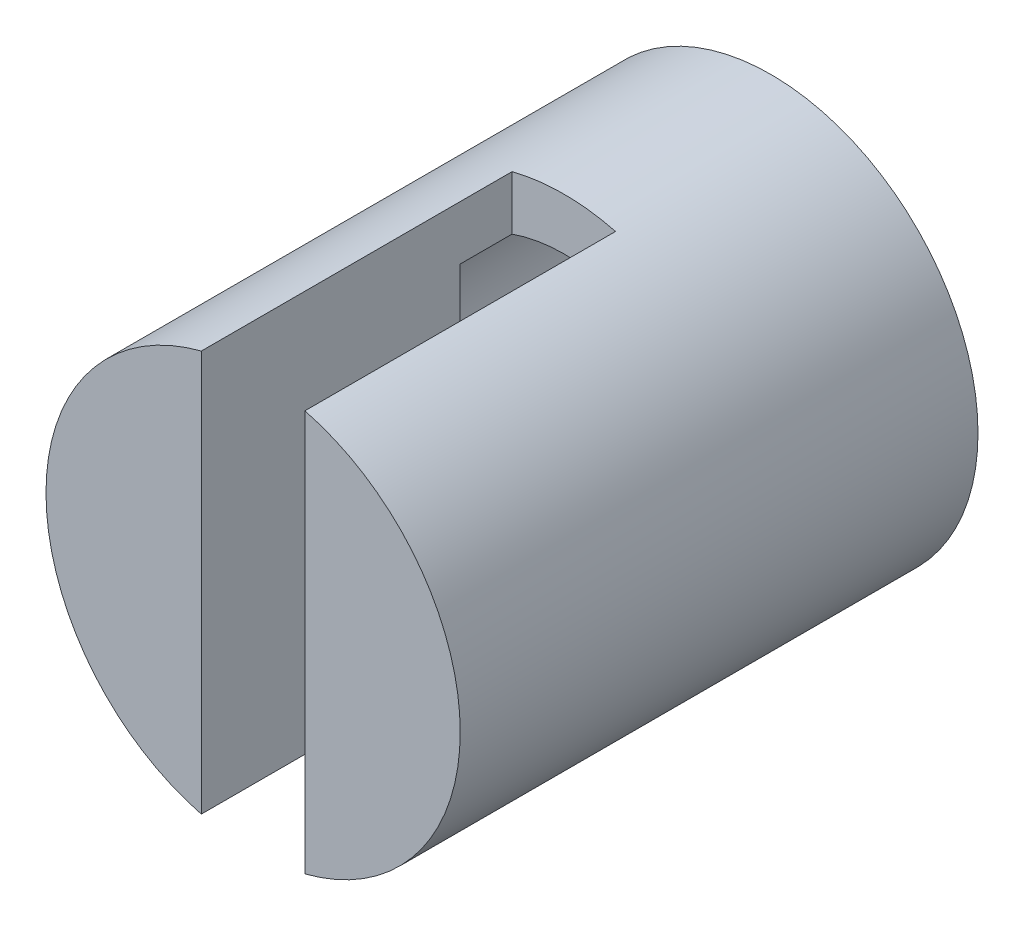
ISO-10303-21;
HEADER;
FILE_DESCRIPTION(('STEP AP214'),'2;1');
FILE_NAME('part.step','',(''),(''),'','','');
FILE_SCHEMA(('AUTOMOTIVE_DESIGN { 1 0 10303 214 1 1 1 1 }'));
ENDSEC;
DATA;
#1=APPLICATION_CONTEXT('core data for automotive mechanical design processes');
#2=APPLICATION_PROTOCOL_DEFINITION('international standard','automotive_design',2000,#1);
#3=PRODUCT_CONTEXT('',#1,'mechanical');
#4=PRODUCT('Part','Part','',(#3));
#5=PRODUCT_RELATED_PRODUCT_CATEGORY('part','',(#4));
#6=PRODUCT_DEFINITION_FORMATION('','',#4);
#7=PRODUCT_DEFINITION_CONTEXT('part definition',#1,'design');
#8=PRODUCT_DEFINITION('design','',#6,#7);
#9=PRODUCT_DEFINITION_SHAPE('','',#8);
#10=(LENGTH_UNIT() NAMED_UNIT(*) SI_UNIT(.MILLI.,.METRE.));
#11=(NAMED_UNIT(*) PLANE_ANGLE_UNIT() SI_UNIT($,.RADIAN.));
#12=(NAMED_UNIT(*) SI_UNIT($,.STERADIAN.) SOLID_ANGLE_UNIT());
#13=UNCERTAINTY_MEASURE_WITH_UNIT(LENGTH_MEASURE(1.E-05),#10,'distance_accuracy_value','');
#14=(GEOMETRIC_REPRESENTATION_CONTEXT(3) GLOBAL_UNCERTAINTY_ASSIGNED_CONTEXT((#13)) GLOBAL_UNIT_ASSIGNED_CONTEXT((#10,
#11,#12)) REPRESENTATION_CONTEXT('',''));
#15=CARTESIAN_POINT('',(0.,0.,0.));
#16=DIRECTION('',(0.,0.,1.));
#17=DIRECTION('',(1.,0.,0.));
#18=AXIS2_PLACEMENT_3D('',#15,#16,#17);
#19=CARTESIAN_POINT('',(0.,0.,-6.));
#20=DIRECTION('',(0.,0.,-1.));
#21=DIRECTION('',(-1.,0.,0.));
#22=AXIS2_PLACEMENT_3D('',#19,#20,#21);
#23=PLANE('',#22);
#24=DIRECTION('',(0.,-1.,0.));
#25=VECTOR('',#24,1.);
#26=CARTESIAN_POINT('',(-1.,38.1192192103208,-6.));
#27=LINE('',#26,#25);
#28=CARTESIAN_POINT('',(-1.,48.522106153225,-6.));
#29=VERTEX_POINT('',#28);
#30=CARTESIAN_POINT('',(-1.,47.4775499317637,-6.));
#31=VERTEX_POINT('',#30);
#32=EDGE_CURVE('E144',#29,#31,#27,.T.);
#33=ORIENTED_EDGE('',*,*,#32,.T.);
#34=CARTESIAN_POINT('',(0.,44.6491228070175,-6.));
#35=DIRECTION('',(0.,0.,-1.));
#36=DIRECTION('',(-1.,0.,0.));
#37=AXIS2_PLACEMENT_3D('',#34,#35,#36);
#38=CIRCLE('',#37,3.);
#39=CARTESIAN_POINT('',(1.,47.4775499317637,-6.));
#40=VERTEX_POINT('',#39);
#41=EDGE_CURVE('E54',#31,#40,#38,.T.);
#42=ORIENTED_EDGE('',*,*,#41,.T.);
#43=DIRECTION('',(0.,1.,0.));
#44=VECTOR('',#43,1.);
#45=CARTESIAN_POINT('',(1.,38.1192192103208,-6.));
#46=LINE('',#45,#44);
#47=CARTESIAN_POINT('',(1.,48.522106153225,-6.));
#48=VERTEX_POINT('',#47);
#49=EDGE_CURVE('E139',#40,#48,#46,.T.);
#50=ORIENTED_EDGE('',*,*,#49,.T.);
#51=CARTESIAN_POINT('',(0.,44.6491228070175,-6.));
#52=DIRECTION('',(0.,0.,-1.));
#53=DIRECTION('',(-1.,0.,0.));
#54=AXIS2_PLACEMENT_3D('',#51,#52,#53);
#55=CIRCLE('',#54,4.);
#56=EDGE_CURVE('E189',#48,#29,#55,.F.);
#57=ORIENTED_EDGE('',*,*,#56,.T.);
#58=EDGE_LOOP('',(#33,#42,#50,#57));
#59=FACE_BOUND('',#58,.T.);
#60=ADVANCED_FACE('F46',(#59),#23,.F.);
#61=CARTESIAN_POINT('',(0.,44.6491228070175,0.));
#62=DIRECTION('',(0.,0.,1.));
#63=DIRECTION('',(1.,0.,0.));
#64=AXIS2_PLACEMENT_3D('',#61,#62,#63);
#65=PLANE('',#64);
#66=DIRECTION('',(0.,1.,0.));
#67=VECTOR('',#66,1.);
#68=CARTESIAN_POINT('',(1.,44.6491228070175,0.));
#69=LINE('',#68,#67);
#70=CARTESIAN_POINT('',(1.,40.7761394608101,0.));
#71=VERTEX_POINT('',#70);
#72=CARTESIAN_POINT('',(1.,48.522106153225,0.));
#73=VERTEX_POINT('',#72);
#74=EDGE_CURVE('E186',#71,#73,#69,.T.);
#75=ORIENTED_EDGE('',*,*,#74,.F.);
#76=CARTESIAN_POINT('',(0.,44.6491228070175,0.));
#77=DIRECTION('',(0.,0.,1.));
#78=DIRECTION('',(1.,0.,0.));
#79=AXIS2_PLACEMENT_3D('',#76,#77,#78);
#80=CIRCLE('',#79,4.);
#81=EDGE_CURVE('E177',#71,#73,#80,.T.);
#82=ORIENTED_EDGE('',*,*,#81,.T.);
#83=EDGE_LOOP('',(#75,#82));
#84=FACE_BOUND('',#83,.T.);
#85=ADVANCED_FACE('F225',(#84),#65,.T.);
#86=CARTESIAN_POINT('',(0.,44.6491228070175,-10.));
#87=DIRECTION('',(0.,0.,1.));
#88=DIRECTION('',(1.,0.,0.));
#89=AXIS2_PLACEMENT_3D('',#86,#87,#88);
#90=CYLINDRICAL_SURFACE('',#89,4.);
#91=DIRECTION('',(0.,0.,1.));
#92=VECTOR('',#91,1.);
#93=CARTESIAN_POINT('',(1.,40.7761394608101,-10.));
#94=LINE('',#93,#92);
#95=CARTESIAN_POINT('',(1.,40.7761394608101,-6.));
#96=VERTEX_POINT('',#95);
#97=EDGE_CURVE('E160',#96,#71,#94,.T.);
#98=ORIENTED_EDGE('',*,*,#97,.F.);
#99=CARTESIAN_POINT('',(-1.,40.7761394608101,-6.));
#100=VERTEX_POINT('',#99);
#101=EDGE_CURVE('E192',#100,#96,#55,.F.);
#102=ORIENTED_EDGE('',*,*,#101,.F.);
#103=DIRECTION('',(0.,0.,1.));
#104=VECTOR('',#103,1.);
#105=CARTESIAN_POINT('',(-1.,40.7761394608101,-10.));
#106=LINE('',#105,#104);
#107=CARTESIAN_POINT('',(-1.,40.7761394608101,0.));
#108=VERTEX_POINT('',#107);
#109=EDGE_CURVE('E165',#108,#100,#106,.F.);
#110=ORIENTED_EDGE('',*,*,#109,.F.);
#111=CARTESIAN_POINT('',(-1.,48.522106153225,0.));
#112=VERTEX_POINT('',#111);
#113=EDGE_CURVE('E176',#112,#108,#80,.T.);
#114=ORIENTED_EDGE('',*,*,#113,.F.);
#115=DIRECTION('',(0.,0.,1.));
#116=VECTOR('',#115,1.);
#117=CARTESIAN_POINT('',(-1.,48.522106153225,-10.));
#118=LINE('',#117,#116);
#119=EDGE_CURVE('E69',#29,#112,#118,.T.);
#120=ORIENTED_EDGE('',*,*,#119,.F.);
#121=ORIENTED_EDGE('',*,*,#56,.F.);
#122=DIRECTION('',(0.,0.,1.));
#123=VECTOR('',#122,1.);
#124=CARTESIAN_POINT('',(1.,48.522106153225,-10.));
#125=LINE('',#124,#123);
#126=EDGE_CURVE('E164',#73,#48,#125,.F.);
#127=ORIENTED_EDGE('',*,*,#126,.F.);
#128=ORIENTED_EDGE('',*,*,#81,.F.);
#129=EDGE_LOOP('',(#98,#102,#110,#114,#120,#121,#127,#128));
#130=FACE_BOUND('',#129,.T.);
#131=CARTESIAN_POINT('',(0.,44.6491228070175,-10.));
#132=DIRECTION('',(0.,0.,1.));
#133=DIRECTION('',(1.,0.,0.));
#134=AXIS2_PLACEMENT_3D('',#131,#132,#133);
#135=CIRCLE('',#134,4.);
#136=CARTESIAN_POINT('',(4.,44.6491228070175,-10.));
#137=VERTEX_POINT('',#136);
#138=EDGE_CURVE('E172',#137,#137,#135,.T.);
#139=ORIENTED_EDGE('',*,*,#138,.T.);
#140=EDGE_LOOP('',(#139));
#141=FACE_BOUND('',#140,.T.);
#142=ADVANCED_FACE('F48',(#130,#141),#90,.T.);
#143=CARTESIAN_POINT('',(0.,44.6491228070175,-10.));
#144=DIRECTION('',(0.,0.,1.));
#145=DIRECTION('',(1.,0.,0.));
#146=AXIS2_PLACEMENT_3D('',#143,#144,#145);
#147=PLANE('',#146);
#148=CARTESIAN_POINT('',(0.,44.6491228070175,-10.));
#149=DIRECTION('',(0.,0.,-1.));
#150=DIRECTION('',(-1.,0.,0.));
#151=AXIS2_PLACEMENT_3D('',#148,#149,#150);
#152=CIRCLE('',#151,3.);
#153=CARTESIAN_POINT('',(-3.,44.6491228070175,-10.));
#154=VERTEX_POINT('',#153);
#155=EDGE_CURVE('E123',#154,#154,#152,.T.);
#156=ORIENTED_EDGE('',*,*,#155,.F.);
#157=EDGE_LOOP('',(#156));
#158=FACE_BOUND('',#157,.T.);
#159=ORIENTED_EDGE('',*,*,#138,.F.);
#160=EDGE_LOOP('',(#159));
#161=FACE_BOUND('',#160,.T.);
#162=ADVANCED_FACE('F224',(#158,#161),#147,.F.);
#163=DIRECTION('',(0.,-1.,0.));
#164=VECTOR('',#163,1.);
#165=CARTESIAN_POINT('',(-1.,44.6491228070175,0.));
#166=LINE('',#165,#164);
#167=EDGE_CURVE('E175',#112,#108,#166,.T.);
#168=ORIENTED_EDGE('',*,*,#167,.F.);
#169=ORIENTED_EDGE('',*,*,#113,.T.);
#170=EDGE_LOOP('',(#168,#169));
#171=FACE_BOUND('',#170,.T.);
#172=ADVANCED_FACE('F222',(#171),#65,.T.);
#173=CARTESIAN_POINT('',(1.,38.1192192103208,-6.));
#174=DIRECTION('',(1.,0.,0.));
#175=DIRECTION('',(0.,0.,-1.));
#176=AXIS2_PLACEMENT_3D('',#173,#174,#175);
#177=PLANE('',#176);
#178=DIRECTION('',(0.,1.,0.));
#179=VECTOR('',#178,1.);
#180=CARTESIAN_POINT('',(1.,38.1192192103208,-5.));
#181=LINE('',#180,#179);
#182=CARTESIAN_POINT('',(1.,41.8206956822714,-5.));
#183=VERTEX_POINT('',#182);
#184=CARTESIAN_POINT('',(1.,47.4775499317637,-5.));
#185=VERTEX_POINT('',#184);
#186=EDGE_CURVE('E137',#183,#185,#181,.T.);
#187=ORIENTED_EDGE('',*,*,#186,.F.);
#188=DIRECTION('',(0.,0.,-1.));
#189=VECTOR('',#188,1.);
#190=CARTESIAN_POINT('',(1.,41.8206956822714,-5.));
#191=LINE('',#190,#189);
#192=CARTESIAN_POINT('',(1.,41.8206956822714,-6.));
#193=VERTEX_POINT('',#192);
#194=EDGE_CURVE('E118',#183,#193,#191,.T.);
#195=ORIENTED_EDGE('',*,*,#194,.T.);
#196=EDGE_CURVE('E140',#96,#193,#46,.T.);
#197=ORIENTED_EDGE('',*,*,#196,.F.);
#198=ORIENTED_EDGE('',*,*,#97,.T.);
#199=ORIENTED_EDGE('',*,*,#74,.T.);
#200=ORIENTED_EDGE('',*,*,#126,.T.);
#201=ORIENTED_EDGE('',*,*,#49,.F.);
#202=DIRECTION('',(0.,0.,-1.));
#203=VECTOR('',#202,1.);
#204=CARTESIAN_POINT('',(1.,47.4775499317637,-5.));
#205=LINE('',#204,#203);
#206=EDGE_CURVE('E117',#40,#185,#205,.F.);
#207=ORIENTED_EDGE('',*,*,#206,.T.);
#208=EDGE_LOOP('',(#187,#195,#197,#198,#199,#200,#201,#207));
#209=FACE_BOUND('',#208,.T.);
#210=ADVANCED_FACE('F203',(#209),#177,.F.);
#211=CARTESIAN_POINT('',(-1.,38.1192192103208,-6.));
#212=DIRECTION('',(-1.,0.,0.));
#213=DIRECTION('',(0.,0.,1.));
#214=AXIS2_PLACEMENT_3D('',#211,#212,#213);
#215=PLANE('',#214);
#216=DIRECTION('',(0.,-1.,0.));
#217=VECTOR('',#216,1.);
#218=CARTESIAN_POINT('',(-1.,38.1192192103208,-5.));
#219=LINE('',#218,#217);
#220=CARTESIAN_POINT('',(-1.,47.4775499317637,-5.));
#221=VERTEX_POINT('',#220);
#222=CARTESIAN_POINT('',(-1.,41.8206956822714,-5.));
#223=VERTEX_POINT('',#222);
#224=EDGE_CURVE('E13',#221,#223,#219,.T.);
#225=ORIENTED_EDGE('',*,*,#224,.F.);
#226=DIRECTION('',(0.,0.,-1.));
#227=VECTOR('',#226,1.);
#228=CARTESIAN_POINT('',(-1.,47.4775499317637,-5.));
#229=LINE('',#228,#227);
#230=EDGE_CURVE('E110',#221,#31,#229,.T.);
#231=ORIENTED_EDGE('',*,*,#230,.T.);
#232=ORIENTED_EDGE('',*,*,#32,.F.);
#233=ORIENTED_EDGE('',*,*,#119,.T.);
#234=ORIENTED_EDGE('',*,*,#167,.T.);
#235=ORIENTED_EDGE('',*,*,#109,.T.);
#236=CARTESIAN_POINT('',(-1.,41.8206956822714,-6.));
#237=VERTEX_POINT('',#236);
#238=EDGE_CURVE('E128',#237,#100,#27,.T.);
#239=ORIENTED_EDGE('',*,*,#238,.F.);
#240=DIRECTION('',(0.,0.,-1.));
#241=VECTOR('',#240,1.);
#242=CARTESIAN_POINT('',(-1.,41.8206956822714,-5.));
#243=LINE('',#242,#241);
#244=EDGE_CURVE('E61',#237,#223,#243,.F.);
#245=ORIENTED_EDGE('',*,*,#244,.T.);
#246=EDGE_LOOP('',(#225,#231,#232,#233,#234,#235,#239,#245));
#247=FACE_BOUND('',#246,.T.);
#248=ADVANCED_FACE('F125',(#247),#215,.F.);
#249=ORIENTED_EDGE('',*,*,#196,.T.);
#250=EDGE_CURVE('E193',#193,#237,#38,.T.);
#251=ORIENTED_EDGE('',*,*,#250,.T.);
#252=ORIENTED_EDGE('',*,*,#238,.T.);
#253=ORIENTED_EDGE('',*,*,#101,.T.);
#254=EDGE_LOOP('',(#249,#251,#252,#253));
#255=FACE_BOUND('',#254,.T.);
#256=ADVANCED_FACE('F197',(#255),#23,.F.);
#257=CARTESIAN_POINT('',(0.,44.6491228070175,-5.));
#258=DIRECTION('',(0.,0.,-1.));
#259=DIRECTION('',(-1.,0.,0.));
#260=AXIS2_PLACEMENT_3D('',#257,#258,#259);
#261=PLANE('',#260);
#262=ORIENTED_EDGE('',*,*,#186,.T.);
#263=CARTESIAN_POINT('',(0.,44.6491228070175,-5.));
#264=DIRECTION('',(0.,0.,-1.));
#265=DIRECTION('',(-1.,0.,0.));
#266=AXIS2_PLACEMENT_3D('',#263,#264,#265);
#267=CIRCLE('',#266,3.);
#268=EDGE_CURVE('E122',#185,#183,#267,.T.);
#269=ORIENTED_EDGE('',*,*,#268,.T.);
#270=EDGE_LOOP('',(#262,#269));
#271=FACE_BOUND('',#270,.T.);
#272=ADVANCED_FACE('F241',(#271),#261,.T.);
#273=ORIENTED_EDGE('',*,*,#224,.T.);
#274=EDGE_CURVE('E113',#223,#221,#267,.T.);
#275=ORIENTED_EDGE('',*,*,#274,.T.);
#276=EDGE_LOOP('',(#273,#275));
#277=FACE_BOUND('',#276,.T.);
#278=ADVANCED_FACE('F121',(#277),#261,.T.);
#279=CARTESIAN_POINT('',(0.,44.6491228070175,-5.));
#280=DIRECTION('',(0.,0.,-1.));
#281=DIRECTION('',(-1.,0.,0.));
#282=AXIS2_PLACEMENT_3D('',#279,#280,#281);
#283=CYLINDRICAL_SURFACE('',#282,3.);
#284=ORIENTED_EDGE('',*,*,#155,.T.);
#285=EDGE_LOOP('',(#284));
#286=FACE_BOUND('',#285,.T.);
#287=ORIENTED_EDGE('',*,*,#41,.F.);
#288=ORIENTED_EDGE('',*,*,#230,.F.);
#289=ORIENTED_EDGE('',*,*,#274,.F.);
#290=ORIENTED_EDGE('',*,*,#244,.F.);
#291=ORIENTED_EDGE('',*,*,#250,.F.);
#292=ORIENTED_EDGE('',*,*,#194,.F.);
#293=ORIENTED_EDGE('',*,*,#268,.F.);
#294=ORIENTED_EDGE('',*,*,#206,.F.);
#295=EDGE_LOOP('',(#287,#288,#289,#290,#291,#292,#293,#294));
#296=FACE_BOUND('',#295,.T.);
#297=ADVANCED_FACE('F112',(#286,#296),#283,.F.);
#298=CLOSED_SHELL('',(#60,#85,#142,#162,#172,#210,#248,#256,#272,#278,#297));
#299=MANIFOLD_SOLID_BREP('B2',#298);
#300=ADVANCED_BREP_SHAPE_REPRESENTATION('',(#18,#299),#14);
#301=SHAPE_DEFINITION_REPRESENTATION(#9,#300);
ENDSEC;
END-ISO-10303-21;
